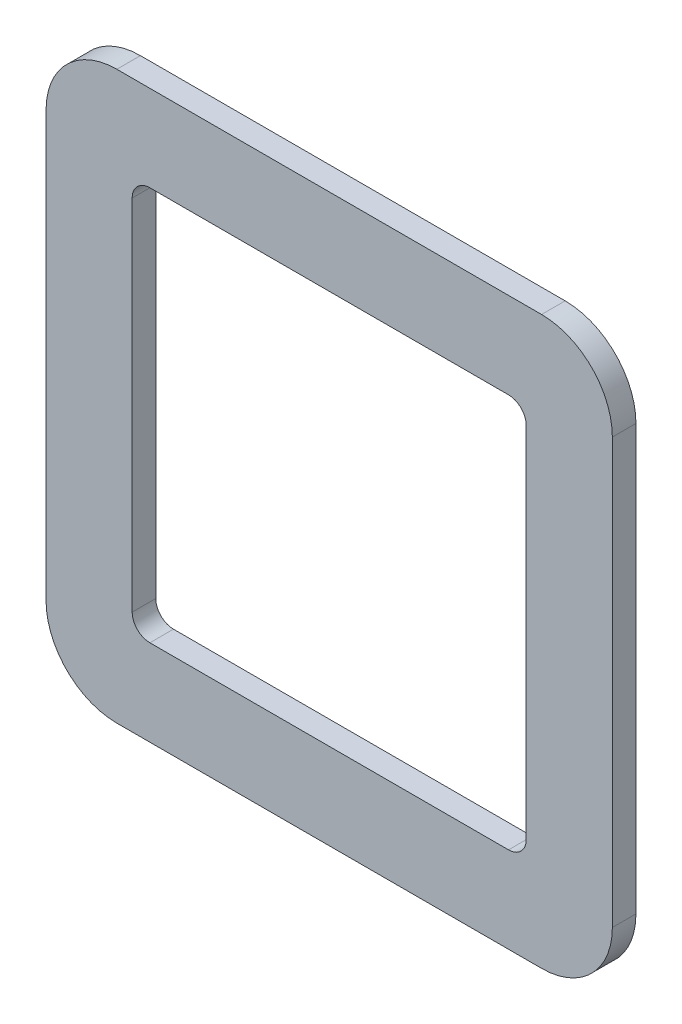
ISO-10303-21;
HEADER;
FILE_DESCRIPTION(('STEP AP214'),'2;1');
FILE_NAME('part.step','',(''),(''),'','','');
FILE_SCHEMA(('AUTOMOTIVE_DESIGN { 1 0 10303 214 1 1 1 1 }'));
ENDSEC;
DATA;
#1=APPLICATION_CONTEXT('core data for automotive mechanical design processes');
#2=APPLICATION_PROTOCOL_DEFINITION('international standard','automotive_design',2000,#1);
#3=PRODUCT_CONTEXT('',#1,'mechanical');
#4=PRODUCT('Part','Part','',(#3));
#5=PRODUCT_RELATED_PRODUCT_CATEGORY('part','',(#4));
#6=PRODUCT_DEFINITION_FORMATION('','',#4);
#7=PRODUCT_DEFINITION_CONTEXT('part definition',#1,'design');
#8=PRODUCT_DEFINITION('design','',#6,#7);
#9=PRODUCT_DEFINITION_SHAPE('','',#8);
#10=(LENGTH_UNIT() NAMED_UNIT(*) SI_UNIT(.MILLI.,.METRE.));
#11=(NAMED_UNIT(*) PLANE_ANGLE_UNIT() SI_UNIT($,.RADIAN.));
#12=(NAMED_UNIT(*) SI_UNIT($,.STERADIAN.) SOLID_ANGLE_UNIT());
#13=UNCERTAINTY_MEASURE_WITH_UNIT(LENGTH_MEASURE(1.E-05),#10,'distance_accuracy_value','');
#14=(GEOMETRIC_REPRESENTATION_CONTEXT(3) GLOBAL_UNCERTAINTY_ASSIGNED_CONTEXT((#13)) GLOBAL_UNIT_ASSIGNED_CONTEXT((#10,
#11,#12)) REPRESENTATION_CONTEXT('',''));
#15=CARTESIAN_POINT('',(0.,0.,0.));
#16=DIRECTION('',(0.,0.,1.));
#17=DIRECTION('',(1.,0.,0.));
#18=AXIS2_PLACEMENT_3D('',#15,#16,#17);
#19=CARTESIAN_POINT('',(6.096,0.762,0.254));
#20=DIRECTION('',(-1.,0.,0.));
#21=DIRECTION('',(0.,-1.,0.));
#22=AXIS2_PLACEMENT_3D('',#19,#20,#21);
#23=PLANE('',#22);
#24=DIRECTION('',(0.,1.,0.));
#25=VECTOR('',#24,1.);
#26=CARTESIAN_POINT('',(6.096,0.762,-0.254));
#27=LINE('',#26,#25);
#28=CARTESIAN_POINT('',(6.09600000000005,-4.57199999999994,-0.254));
#29=VERTEX_POINT('',#28);
#30=CARTESIAN_POINT('',(6.096,4.572,-0.254));
#31=VERTEX_POINT('',#30);
#32=EDGE_CURVE('E243',#29,#31,#27,.T.);
#33=ORIENTED_EDGE('',*,*,#32,.T.);
#34=DIRECTION('',(0.,0.,-1.));
#35=VECTOR('',#34,1.);
#36=CARTESIAN_POINT('',(6.096,4.572,0.254));
#37=LINE('',#36,#35);
#38=CARTESIAN_POINT('',(6.096,4.572,0.254));
#39=VERTEX_POINT('',#38);
#40=EDGE_CURVE('E12',#39,#31,#37,.T.);
#41=ORIENTED_EDGE('',*,*,#40,.F.);
#42=DIRECTION('',(0.,1.,0.));
#43=VECTOR('',#42,1.);
#44=CARTESIAN_POINT('',(6.096,0.762,0.254));
#45=LINE('',#44,#43);
#46=CARTESIAN_POINT('',(6.09600000000005,-4.57199999999994,0.254));
#47=VERTEX_POINT('',#46);
#48=EDGE_CURVE('E87',#47,#39,#45,.T.);
#49=ORIENTED_EDGE('',*,*,#48,.F.);
#50=DIRECTION('',(0.,0.,-1.));
#51=VECTOR('',#50,1.);
#52=CARTESIAN_POINT('',(6.09600000000005,-4.57199999999994,0.254));
#53=LINE('',#52,#51);
#54=EDGE_CURVE('E177',#47,#29,#53,.T.);
#55=ORIENTED_EDGE('',*,*,#54,.T.);
#56=EDGE_LOOP('',(#33,#41,#49,#55));
#57=FACE_BOUND('',#56,.T.);
#58=ADVANCED_FACE('F39',(#57),#23,.F.);
#59=CARTESIAN_POINT('',(4.572,4.572,0.254));
#60=DIRECTION('',(0.,0.,-1.));
#61=DIRECTION('',(-1.,0.,0.));
#62=AXIS2_PLACEMENT_3D('',#59,#60,#61);
#63=CYLINDRICAL_SURFACE('',#62,1.524);
#64=CARTESIAN_POINT('',(4.572,4.572,-0.254));
#65=DIRECTION('',(0.,0.,1.));
#66=DIRECTION('',(1.,0.,0.));
#67=AXIS2_PLACEMENT_3D('',#64,#65,#66);
#68=CIRCLE('',#67,1.524);
#69=CARTESIAN_POINT('',(4.572,6.096,-0.254));
#70=VERTEX_POINT('',#69);
#71=EDGE_CURVE('E260',#31,#70,#68,.T.);
#72=ORIENTED_EDGE('',*,*,#71,.T.);
#73=DIRECTION('',(0.,0.,-1.));
#74=VECTOR('',#73,1.);
#75=CARTESIAN_POINT('',(4.572,6.096,0.254));
#76=LINE('',#75,#74);
#77=CARTESIAN_POINT('',(4.572,6.096,0.254));
#78=VERTEX_POINT('',#77);
#79=EDGE_CURVE('E47',#78,#70,#76,.T.);
#80=ORIENTED_EDGE('',*,*,#79,.F.);
#81=CARTESIAN_POINT('',(4.572,4.572,0.254));
#82=DIRECTION('',(0.,0.,1.));
#83=DIRECTION('',(1.,0.,0.));
#84=AXIS2_PLACEMENT_3D('',#81,#82,#83);
#85=CIRCLE('',#84,1.524);
#86=EDGE_CURVE('E245',#39,#78,#85,.T.);
#87=ORIENTED_EDGE('',*,*,#86,.F.);
#88=ORIENTED_EDGE('',*,*,#40,.T.);
#89=EDGE_LOOP('',(#72,#80,#87,#88));
#90=FACE_BOUND('',#89,.T.);
#91=ADVANCED_FACE('F289',(#90),#63,.T.);
#92=CARTESIAN_POINT('',(4.572,6.096,0.254));
#93=DIRECTION('',(0.,-1.,0.));
#94=DIRECTION('',(0.,0.,-1.));
#95=AXIS2_PLACEMENT_3D('',#92,#93,#94);
#96=PLANE('',#95);
#97=DIRECTION('',(0.,0.,-1.));
#98=VECTOR('',#97,1.);
#99=CARTESIAN_POINT('',(-4.57200000000002,6.09599999999998,0.254));
#100=LINE('',#99,#98);
#101=CARTESIAN_POINT('',(-4.57200000000002,6.09599999999998,0.254));
#102=VERTEX_POINT('',#101);
#103=CARTESIAN_POINT('',(-4.57200000000002,6.09599999999998,-0.254));
#104=VERTEX_POINT('',#103);
#105=EDGE_CURVE('E240',#102,#104,#100,.T.);
#106=ORIENTED_EDGE('',*,*,#105,.F.);
#107=DIRECTION('',(-1.,0.,0.));
#108=VECTOR('',#107,1.);
#109=CARTESIAN_POINT('',(4.572,6.096,0.254));
#110=LINE('',#109,#108);
#111=EDGE_CURVE('E247',#78,#102,#110,.T.);
#112=ORIENTED_EDGE('',*,*,#111,.F.);
#113=ORIENTED_EDGE('',*,*,#79,.T.);
#114=DIRECTION('',(-1.,0.,0.));
#115=VECTOR('',#114,1.);
#116=CARTESIAN_POINT('',(4.572,6.096,-0.254));
#117=LINE('',#116,#115);
#118=EDGE_CURVE('E262',#70,#104,#117,.T.);
#119=ORIENTED_EDGE('',*,*,#118,.T.);
#120=EDGE_LOOP('',(#106,#112,#113,#119));
#121=FACE_BOUND('',#120,.T.);
#122=ADVANCED_FACE('F275',(#121),#96,.F.);
#123=CARTESIAN_POINT('',(-0.889000000000001,4.2418,0.254));
#124=DIRECTION('',(0.,1.,0.));
#125=DIRECTION('',(-1.,0.,0.));
#126=AXIS2_PLACEMENT_3D('',#123,#124,#125);
#127=PLANE('',#126);
#128=DIRECTION('',(1.,0.,0.));
#129=VECTOR('',#128,1.);
#130=CARTESIAN_POINT('',(-0.889000000000001,4.2418,-0.254));
#131=LINE('',#130,#129);
#132=CARTESIAN_POINT('',(-3.86080000000001,4.24179999999999,-0.254));
#133=VERTEX_POINT('',#132);
#134=CARTESIAN_POINT('',(3.8608,4.2418,-0.254));
#135=VERTEX_POINT('',#134);
#136=EDGE_CURVE('E73',#133,#135,#131,.T.);
#137=ORIENTED_EDGE('',*,*,#136,.T.);
#138=DIRECTION('',(0.,0.,-1.));
#139=VECTOR('',#138,1.);
#140=CARTESIAN_POINT('',(3.8608,4.2418,0.254));
#141=LINE('',#140,#139);
#142=CARTESIAN_POINT('',(3.8608,4.2418,0.254));
#143=VERTEX_POINT('',#142);
#144=EDGE_CURVE('E268',#143,#135,#141,.T.);
#145=ORIENTED_EDGE('',*,*,#144,.F.);
#146=DIRECTION('',(1.,0.,0.));
#147=VECTOR('',#146,1.);
#148=CARTESIAN_POINT('',(-0.889000000000001,4.2418,0.254));
#149=LINE('',#148,#147);
#150=CARTESIAN_POINT('',(-3.86080000000001,4.24179999999999,0.254));
#151=VERTEX_POINT('',#150);
#152=EDGE_CURVE('E251',#151,#143,#149,.T.);
#153=ORIENTED_EDGE('',*,*,#152,.F.);
#154=DIRECTION('',(0.,0.,-1.));
#155=VECTOR('',#154,1.);
#156=CARTESIAN_POINT('',(-3.86080000000001,4.24179999999999,0.254));
#157=LINE('',#156,#155);
#158=EDGE_CURVE('E225',#151,#133,#157,.T.);
#159=ORIENTED_EDGE('',*,*,#158,.T.);
#160=EDGE_LOOP('',(#137,#145,#153,#159));
#161=FACE_BOUND('',#160,.T.);
#162=ADVANCED_FACE('F327',(#161),#127,.F.);
#163=CARTESIAN_POINT('',(3.8608,3.8608,0.254));
#164=DIRECTION('',(0.,0.,-1.));
#165=DIRECTION('',(-1.,0.,0.));
#166=AXIS2_PLACEMENT_3D('',#163,#164,#165);
#167=CYLINDRICAL_SURFACE('',#166,0.380999999999999);
#168=CARTESIAN_POINT('',(3.8608,3.8608,-0.254));
#169=DIRECTION('',(0.,0.,-1.));
#170=DIRECTION('',(-1.,0.,0.));
#171=AXIS2_PLACEMENT_3D('',#168,#169,#170);
#172=CIRCLE('',#171,0.380999999999999);
#173=CARTESIAN_POINT('',(4.2418,3.8608,-0.254));
#174=VERTEX_POINT('',#173);
#175=EDGE_CURVE('E79',#135,#174,#172,.T.);
#176=ORIENTED_EDGE('',*,*,#175,.T.);
#177=DIRECTION('',(0.,0.,-1.));
#178=VECTOR('',#177,1.);
#179=CARTESIAN_POINT('',(4.2418,3.8608,0.254));
#180=LINE('',#179,#178);
#181=CARTESIAN_POINT('',(4.2418,3.8608,0.254));
#182=VERTEX_POINT('',#181);
#183=EDGE_CURVE('E258',#182,#174,#180,.T.);
#184=ORIENTED_EDGE('',*,*,#183,.F.);
#185=CARTESIAN_POINT('',(3.8608,3.8608,0.254));
#186=DIRECTION('',(0.,0.,-1.));
#187=DIRECTION('',(-1.,0.,0.));
#188=AXIS2_PLACEMENT_3D('',#185,#186,#187);
#189=CIRCLE('',#188,0.380999999999999);
#190=EDGE_CURVE('E55',#143,#182,#189,.T.);
#191=ORIENTED_EDGE('',*,*,#190,.F.);
#192=ORIENTED_EDGE('',*,*,#144,.T.);
#193=EDGE_LOOP('',(#176,#184,#191,#192));
#194=FACE_BOUND('',#193,.T.);
#195=ADVANCED_FACE('F321',(#194),#167,.F.);
#196=CARTESIAN_POINT('',(4.2418,3.8608,0.254));
#197=DIRECTION('',(1.,0.,0.));
#198=DIRECTION('',(0.,0.,-1.));
#199=AXIS2_PLACEMENT_3D('',#196,#197,#198);
#200=PLANE('',#199);
#201=DIRECTION('',(0.,0.,-1.));
#202=VECTOR('',#201,1.);
#203=CARTESIAN_POINT('',(4.24180000000004,-3.86079999999996,0.254));
#204=LINE('',#203,#202);
#205=CARTESIAN_POINT('',(4.24180000000004,-3.86079999999996,0.254));
#206=VERTEX_POINT('',#205);
#207=CARTESIAN_POINT('',(4.24180000000004,-3.86079999999996,-0.254));
#208=VERTEX_POINT('',#207);
#209=EDGE_CURVE('E188',#206,#208,#204,.T.);
#210=ORIENTED_EDGE('',*,*,#209,.F.);
#211=DIRECTION('',(0.,-1.,0.));
#212=VECTOR('',#211,1.);
#213=CARTESIAN_POINT('',(4.2418,3.8608,0.254));
#214=LINE('',#213,#212);
#215=EDGE_CURVE('E256',#182,#206,#214,.T.);
#216=ORIENTED_EDGE('',*,*,#215,.F.);
#217=ORIENTED_EDGE('',*,*,#183,.T.);
#218=DIRECTION('',(0.,-1.,0.));
#219=VECTOR('',#218,1.);
#220=CARTESIAN_POINT('',(4.2418,3.8608,-0.254));
#221=LINE('',#220,#219);
#222=EDGE_CURVE('E246',#174,#208,#221,.T.);
#223=ORIENTED_EDGE('',*,*,#222,.T.);
#224=EDGE_LOOP('',(#210,#216,#217,#223));
#225=FACE_BOUND('',#224,.T.);
#226=ADVANCED_FACE('F320',(#225),#200,.F.);
#227=CARTESIAN_POINT('',(4.572,4.572,0.254));
#228=DIRECTION('',(0.,0.,1.));
#229=DIRECTION('',(1.,0.,0.));
#230=AXIS2_PLACEMENT_3D('',#227,#228,#229);
#231=PLANE('',#230);
#232=CARTESIAN_POINT('',(-3.86080000000001,3.86079999999999,0.254));
#233=DIRECTION('',(0.,0.,-1.));
#234=DIRECTION('',(0.,-1.,0.));
#235=AXIS2_PLACEMENT_3D('',#232,#233,#234);
#236=CIRCLE('',#235,0.380999999999999);
#237=CARTESIAN_POINT('',(-4.24180000000001,3.86079999999999,0.254));
#238=VERTEX_POINT('',#237);
#239=EDGE_CURVE('E222',#238,#151,#236,.T.);
#240=ORIENTED_EDGE('',*,*,#239,.T.);
#241=ORIENTED_EDGE('',*,*,#152,.T.);
#242=ORIENTED_EDGE('',*,*,#190,.T.);
#243=ORIENTED_EDGE('',*,*,#215,.T.);
#244=CARTESIAN_POINT('',(3.86080000000004,-3.86079999999996,0.254));
#245=DIRECTION('',(0.,0.,-1.));
#246=DIRECTION('',(0.,1.,0.));
#247=AXIS2_PLACEMENT_3D('',#244,#245,#246);
#248=CIRCLE('',#247,0.380999999999999);
#249=CARTESIAN_POINT('',(3.86080000000004,-4.24179999999996,0.254));
#250=VERTEX_POINT('',#249);
#251=EDGE_CURVE('E178',#206,#250,#248,.T.);
#252=ORIENTED_EDGE('',*,*,#251,.T.);
#253=DIRECTION('',(-1.,0.,0.));
#254=VECTOR('',#253,1.);
#255=CARTESIAN_POINT('',(0.889000000000001,-4.2418,0.254));
#256=LINE('',#255,#254);
#257=CARTESIAN_POINT('',(-3.8608,-4.2418,0.254));
#258=VERTEX_POINT('',#257);
#259=EDGE_CURVE('E169',#250,#258,#256,.T.);
#260=ORIENTED_EDGE('',*,*,#259,.T.);
#261=CARTESIAN_POINT('',(-3.8608,-3.8608,0.254));
#262=DIRECTION('',(0.,0.,-1.));
#263=DIRECTION('',(1.,0.,0.));
#264=AXIS2_PLACEMENT_3D('',#261,#262,#263);
#265=CIRCLE('',#264,0.380999999999999);
#266=CARTESIAN_POINT('',(-4.2418,-3.8608,0.254));
#267=VERTEX_POINT('',#266);
#268=EDGE_CURVE('E195',#258,#267,#265,.T.);
#269=ORIENTED_EDGE('',*,*,#268,.T.);
#270=DIRECTION('',(0.,1.,0.));
#271=VECTOR('',#270,1.);
#272=CARTESIAN_POINT('',(-4.2418,-0.889000000000015,0.254));
#273=LINE('',#272,#271);
#274=EDGE_CURVE('E220',#267,#238,#273,.T.);
#275=ORIENTED_EDGE('',*,*,#274,.T.);
#276=EDGE_LOOP('',(#240,#241,#242,#243,#252,#260,#269,#275));
#277=FACE_BOUND('',#276,.T.);
#278=ORIENTED_EDGE('',*,*,#48,.T.);
#279=ORIENTED_EDGE('',*,*,#86,.T.);
#280=ORIENTED_EDGE('',*,*,#111,.T.);
#281=CARTESIAN_POINT('',(-4.57200000000002,4.57199999999998,0.254));
#282=DIRECTION('',(0.,0.,1.));
#283=DIRECTION('',(0.,1.,0.));
#284=AXIS2_PLACEMENT_3D('',#281,#282,#283);
#285=CIRCLE('',#284,1.524);
#286=CARTESIAN_POINT('',(-6.09600000000002,4.57199999999998,0.254));
#287=VERTEX_POINT('',#286);
#288=EDGE_CURVE('E215',#102,#287,#285,.T.);
#289=ORIENTED_EDGE('',*,*,#288,.T.);
#290=DIRECTION('',(0.,-1.,0.));
#291=VECTOR('',#290,1.);
#292=CARTESIAN_POINT('',(-6.09600000000002,4.57199999999998,0.254));
#293=LINE('',#292,#291);
#294=CARTESIAN_POINT('',(-6.096,-4.572,0.254));
#295=VERTEX_POINT('',#294);
#296=EDGE_CURVE('E217',#287,#295,#293,.T.);
#297=ORIENTED_EDGE('',*,*,#296,.T.);
#298=CARTESIAN_POINT('',(-4.572,-4.572,0.254));
#299=DIRECTION('',(0.,0.,1.));
#300=DIRECTION('',(-1.,0.,0.));
#301=AXIS2_PLACEMENT_3D('',#298,#299,#300);
#302=CIRCLE('',#301,1.524);
#303=CARTESIAN_POINT('',(-4.572,-6.096,0.254));
#304=VERTEX_POINT('',#303);
#305=EDGE_CURVE('E164',#295,#304,#302,.T.);
#306=ORIENTED_EDGE('',*,*,#305,.T.);
#307=DIRECTION('',(1.,0.,0.));
#308=VECTOR('',#307,1.);
#309=CARTESIAN_POINT('',(-4.572,-6.096,0.254));
#310=LINE('',#309,#308);
#311=CARTESIAN_POINT('',(4.57200000000006,-6.09599999999995,0.254));
#312=VERTEX_POINT('',#311);
#313=EDGE_CURVE('E158',#304,#312,#310,.T.);
#314=ORIENTED_EDGE('',*,*,#313,.T.);
#315=CARTESIAN_POINT('',(4.57200000000005,-4.57199999999995,0.254));
#316=DIRECTION('',(0.,0.,1.));
#317=DIRECTION('',(0.,-1.,0.));
#318=AXIS2_PLACEMENT_3D('',#315,#316,#317);
#319=CIRCLE('',#318,1.524);
#320=EDGE_CURVE('E161',#312,#47,#319,.T.);
#321=ORIENTED_EDGE('',*,*,#320,.T.);
#322=EDGE_LOOP('',(#278,#279,#280,#289,#297,#306,#314,#321));
#323=FACE_BOUND('',#322,.T.);
#324=ADVANCED_FACE('F160',(#277,#323),#231,.T.);
#325=CARTESIAN_POINT('',(4.572,4.572,-0.254));
#326=DIRECTION('',(0.,0.,1.));
#327=DIRECTION('',(1.,0.,0.));
#328=AXIS2_PLACEMENT_3D('',#325,#326,#327);
#329=PLANE('',#328);
#330=ORIENTED_EDGE('',*,*,#136,.F.);
#331=CARTESIAN_POINT('',(-3.86080000000001,3.86079999999999,-0.254));
#332=DIRECTION('',(0.,0.,-1.));
#333=DIRECTION('',(0.,-1.,0.));
#334=AXIS2_PLACEMENT_3D('',#331,#332,#333);
#335=CIRCLE('',#334,0.380999999999999);
#336=CARTESIAN_POINT('',(-4.24180000000001,3.86079999999999,-0.254));
#337=VERTEX_POINT('',#336);
#338=EDGE_CURVE('E218',#337,#133,#335,.T.);
#339=ORIENTED_EDGE('',*,*,#338,.F.);
#340=DIRECTION('',(0.,1.,0.));
#341=VECTOR('',#340,1.);
#342=CARTESIAN_POINT('',(-4.2418,-0.889000000000015,-0.254));
#343=LINE('',#342,#341);
#344=CARTESIAN_POINT('',(-4.2418,-3.8608,-0.254));
#345=VERTEX_POINT('',#344);
#346=EDGE_CURVE('E229',#345,#337,#343,.T.);
#347=ORIENTED_EDGE('',*,*,#346,.F.);
#348=CARTESIAN_POINT('',(-3.8608,-3.8608,-0.254));
#349=DIRECTION('',(0.,0.,-1.));
#350=DIRECTION('',(1.,0.,0.));
#351=AXIS2_PLACEMENT_3D('',#348,#349,#350);
#352=CIRCLE('',#351,0.380999999999999);
#353=CARTESIAN_POINT('',(-3.8608,-4.2418,-0.254));
#354=VERTEX_POINT('',#353);
#355=EDGE_CURVE('E192',#354,#345,#352,.T.);
#356=ORIENTED_EDGE('',*,*,#355,.F.);
#357=DIRECTION('',(-1.,0.,0.));
#358=VECTOR('',#357,1.);
#359=CARTESIAN_POINT('',(0.889000000000001,-4.2418,-0.254));
#360=LINE('',#359,#358);
#361=CARTESIAN_POINT('',(3.86080000000004,-4.24179999999996,-0.254));
#362=VERTEX_POINT('',#361);
#363=EDGE_CURVE('E200',#362,#354,#360,.T.);
#364=ORIENTED_EDGE('',*,*,#363,.F.);
#365=CARTESIAN_POINT('',(3.86080000000004,-3.86079999999996,-0.254));
#366=DIRECTION('',(0.,0.,-1.));
#367=DIRECTION('',(0.,1.,0.));
#368=AXIS2_PLACEMENT_3D('',#365,#366,#367);
#369=CIRCLE('',#368,0.380999999999999);
#370=EDGE_CURVE('E179',#208,#362,#369,.T.);
#371=ORIENTED_EDGE('',*,*,#370,.F.);
#372=ORIENTED_EDGE('',*,*,#222,.F.);
#373=ORIENTED_EDGE('',*,*,#175,.F.);
#374=EDGE_LOOP('',(#330,#339,#347,#356,#364,#371,#372,#373));
#375=FACE_BOUND('',#374,.T.);
#376=CARTESIAN_POINT('',(-4.57200000000002,4.57199999999998,-0.254));
#377=DIRECTION('',(0.,0.,1.));
#378=DIRECTION('',(0.,1.,0.));
#379=AXIS2_PLACEMENT_3D('',#376,#377,#378);
#380=CIRCLE('',#379,1.524);
#381=CARTESIAN_POINT('',(-6.09600000000002,4.57199999999998,-0.254));
#382=VERTEX_POINT('',#381);
#383=EDGE_CURVE('E214',#104,#382,#380,.T.);
#384=ORIENTED_EDGE('',*,*,#383,.F.);
#385=ORIENTED_EDGE('',*,*,#118,.F.);
#386=ORIENTED_EDGE('',*,*,#71,.F.);
#387=ORIENTED_EDGE('',*,*,#32,.F.);
#388=CARTESIAN_POINT('',(4.57200000000005,-4.57199999999995,-0.254));
#389=DIRECTION('',(0.,0.,1.));
#390=DIRECTION('',(0.,-1.,0.));
#391=AXIS2_PLACEMENT_3D('',#388,#389,#390);
#392=CIRCLE('',#391,1.524);
#393=CARTESIAN_POINT('',(4.57200000000006,-6.09599999999995,-0.254));
#394=VERTEX_POINT('',#393);
#395=EDGE_CURVE('E291',#394,#29,#392,.T.);
#396=ORIENTED_EDGE('',*,*,#395,.F.);
#397=DIRECTION('',(1.,0.,0.));
#398=VECTOR('',#397,1.);
#399=CARTESIAN_POINT('',(-4.572,-6.096,-0.254));
#400=LINE('',#399,#398);
#401=CARTESIAN_POINT('',(-4.572,-6.096,-0.254));
#402=VERTEX_POINT('',#401);
#403=EDGE_CURVE('E183',#402,#394,#400,.T.);
#404=ORIENTED_EDGE('',*,*,#403,.F.);
#405=CARTESIAN_POINT('',(-4.572,-4.572,-0.254));
#406=DIRECTION('',(0.,0.,1.));
#407=DIRECTION('',(-1.,0.,0.));
#408=AXIS2_PLACEMENT_3D('',#405,#406,#407);
#409=CIRCLE('',#408,1.524);
#410=CARTESIAN_POINT('',(-6.096,-4.572,-0.254));
#411=VERTEX_POINT('',#410);
#412=EDGE_CURVE('E185',#411,#402,#409,.T.);
#413=ORIENTED_EDGE('',*,*,#412,.F.);
#414=DIRECTION('',(0.,-1.,0.));
#415=VECTOR('',#414,1.);
#416=CARTESIAN_POINT('',(-6.09600000000002,4.57199999999998,-0.254));
#417=LINE('',#416,#415);
#418=EDGE_CURVE('E227',#382,#411,#417,.T.);
#419=ORIENTED_EDGE('',*,*,#418,.F.);
#420=EDGE_LOOP('',(#384,#385,#386,#387,#396,#404,#413,#419));
#421=FACE_BOUND('',#420,.T.);
#422=ADVANCED_FACE('F280',(#375,#421),#329,.F.);
#423=CARTESIAN_POINT('',(-4.57200000000002,4.57199999999998,0.254));
#424=DIRECTION('',(0.,0.,-1.));
#425=DIRECTION('',(-1.,0.,0.));
#426=AXIS2_PLACEMENT_3D('',#423,#424,#425);
#427=CYLINDRICAL_SURFACE('',#426,1.524);
#428=ORIENTED_EDGE('',*,*,#383,.T.);
#429=DIRECTION('',(0.,0.,-1.));
#430=VECTOR('',#429,1.);
#431=CARTESIAN_POINT('',(-6.09600000000002,4.57199999999998,0.254));
#432=LINE('',#431,#430);
#433=EDGE_CURVE('E237',#287,#382,#432,.T.);
#434=ORIENTED_EDGE('',*,*,#433,.F.);
#435=ORIENTED_EDGE('',*,*,#288,.F.);
#436=ORIENTED_EDGE('',*,*,#105,.T.);
#437=EDGE_LOOP('',(#428,#434,#435,#436));
#438=FACE_BOUND('',#437,.T.);
#439=ADVANCED_FACE('F286',(#438),#427,.T.);
#440=CARTESIAN_POINT('',(-6.09600000000002,4.57199999999998,0.254));
#441=DIRECTION('',(1.,0.,0.));
#442=DIRECTION('',(0.,1.,0.));
#443=AXIS2_PLACEMENT_3D('',#440,#441,#442);
#444=PLANE('',#443);
#445=DIRECTION('',(0.,0.,-1.));
#446=VECTOR('',#445,1.);
#447=CARTESIAN_POINT('',(-6.096,-4.572,0.254));
#448=LINE('',#447,#446);
#449=EDGE_CURVE('E211',#295,#411,#448,.T.);
#450=ORIENTED_EDGE('',*,*,#449,.F.);
#451=ORIENTED_EDGE('',*,*,#296,.F.);
#452=ORIENTED_EDGE('',*,*,#433,.T.);
#453=ORIENTED_EDGE('',*,*,#418,.T.);
#454=EDGE_LOOP('',(#450,#451,#452,#453));
#455=FACE_BOUND('',#454,.T.);
#456=ADVANCED_FACE('F393',(#455),#444,.F.);
#457=CARTESIAN_POINT('',(-4.2418,-0.889000000000015,0.254));
#458=DIRECTION('',(-1.,0.,0.));
#459=DIRECTION('',(0.,-1.,0.));
#460=AXIS2_PLACEMENT_3D('',#457,#458,#459);
#461=PLANE('',#460);
#462=ORIENTED_EDGE('',*,*,#346,.T.);
#463=DIRECTION('',(0.,0.,-1.));
#464=VECTOR('',#463,1.);
#465=CARTESIAN_POINT('',(-4.24180000000001,3.86079999999999,0.254));
#466=LINE('',#465,#464);
#467=EDGE_CURVE('E234',#238,#337,#466,.T.);
#468=ORIENTED_EDGE('',*,*,#467,.F.);
#469=ORIENTED_EDGE('',*,*,#274,.F.);
#470=DIRECTION('',(0.,0.,-1.));
#471=VECTOR('',#470,1.);
#472=CARTESIAN_POINT('',(-4.2418,-3.8608,0.254));
#473=LINE('',#472,#471);
#474=EDGE_CURVE('E197',#267,#345,#473,.T.);
#475=ORIENTED_EDGE('',*,*,#474,.T.);
#476=EDGE_LOOP('',(#462,#468,#469,#475));
#477=FACE_BOUND('',#476,.T.);
#478=ADVANCED_FACE('F403',(#477),#461,.F.);
#479=CARTESIAN_POINT('',(-3.86080000000001,3.86079999999999,0.254));
#480=DIRECTION('',(0.,0.,-1.));
#481=DIRECTION('',(-1.,0.,0.));
#482=AXIS2_PLACEMENT_3D('',#479,#480,#481);
#483=CYLINDRICAL_SURFACE('',#482,0.380999999999999);
#484=ORIENTED_EDGE('',*,*,#338,.T.);
#485=ORIENTED_EDGE('',*,*,#158,.F.);
#486=ORIENTED_EDGE('',*,*,#239,.F.);
#487=ORIENTED_EDGE('',*,*,#467,.T.);
#488=EDGE_LOOP('',(#484,#485,#486,#487));
#489=FACE_BOUND('',#488,.T.);
#490=ADVANCED_FACE('F325',(#489),#483,.F.);
#491=CARTESIAN_POINT('',(-4.572,-4.572,0.254));
#492=DIRECTION('',(0.,0.,-1.));
#493=DIRECTION('',(-1.,0.,0.));
#494=AXIS2_PLACEMENT_3D('',#491,#492,#493);
#495=CYLINDRICAL_SURFACE('',#494,1.524);
#496=ORIENTED_EDGE('',*,*,#412,.T.);
#497=DIRECTION('',(0.,0.,-1.));
#498=VECTOR('',#497,1.);
#499=CARTESIAN_POINT('',(-4.572,-6.096,0.254));
#500=LINE('',#499,#498);
#501=EDGE_CURVE('E209',#304,#402,#500,.T.);
#502=ORIENTED_EDGE('',*,*,#501,.F.);
#503=ORIENTED_EDGE('',*,*,#305,.F.);
#504=ORIENTED_EDGE('',*,*,#449,.T.);
#505=EDGE_LOOP('',(#496,#502,#503,#504));
#506=FACE_BOUND('',#505,.T.);
#507=ADVANCED_FACE('F423',(#506),#495,.T.);
#508=CARTESIAN_POINT('',(-4.572,-6.096,0.254));
#509=DIRECTION('',(0.,1.,0.));
#510=DIRECTION('',(0.,0.,1.));
#511=AXIS2_PLACEMENT_3D('',#508,#509,#510);
#512=PLANE('',#511);
#513=DIRECTION('',(0.,0.,-1.));
#514=VECTOR('',#513,1.);
#515=CARTESIAN_POINT('',(4.57200000000006,-6.09599999999995,0.254));
#516=LINE('',#515,#514);
#517=EDGE_CURVE('E175',#312,#394,#516,.T.);
#518=ORIENTED_EDGE('',*,*,#517,.F.);
#519=ORIENTED_EDGE('',*,*,#313,.F.);
#520=ORIENTED_EDGE('',*,*,#501,.T.);
#521=ORIENTED_EDGE('',*,*,#403,.T.);
#522=EDGE_LOOP('',(#518,#519,#520,#521));
#523=FACE_BOUND('',#522,.T.);
#524=ADVANCED_FACE('F181',(#523),#512,.F.);
#525=CARTESIAN_POINT('',(0.889000000000001,-4.2418,0.254));
#526=DIRECTION('',(0.,-1.,0.));
#527=DIRECTION('',(1.,0.,0.));
#528=AXIS2_PLACEMENT_3D('',#525,#526,#527);
#529=PLANE('',#528);
#530=ORIENTED_EDGE('',*,*,#363,.T.);
#531=DIRECTION('',(0.,0.,-1.));
#532=VECTOR('',#531,1.);
#533=CARTESIAN_POINT('',(-3.8608,-4.2418,0.254));
#534=LINE('',#533,#532);
#535=EDGE_CURVE('E206',#258,#354,#534,.T.);
#536=ORIENTED_EDGE('',*,*,#535,.F.);
#537=ORIENTED_EDGE('',*,*,#259,.F.);
#538=DIRECTION('',(0.,0.,-1.));
#539=VECTOR('',#538,1.);
#540=CARTESIAN_POINT('',(3.86080000000004,-4.24179999999996,0.254));
#541=LINE('',#540,#539);
#542=EDGE_CURVE('E297',#250,#362,#541,.T.);
#543=ORIENTED_EDGE('',*,*,#542,.T.);
#544=EDGE_LOOP('',(#530,#536,#537,#543));
#545=FACE_BOUND('',#544,.T.);
#546=ADVANCED_FACE('F314',(#545),#529,.F.);
#547=CARTESIAN_POINT('',(-3.8608,-3.8608,0.254));
#548=DIRECTION('',(0.,0.,-1.));
#549=DIRECTION('',(-1.,0.,0.));
#550=AXIS2_PLACEMENT_3D('',#547,#548,#549);
#551=CYLINDRICAL_SURFACE('',#550,0.380999999999999);
#552=ORIENTED_EDGE('',*,*,#355,.T.);
#553=ORIENTED_EDGE('',*,*,#474,.F.);
#554=ORIENTED_EDGE('',*,*,#268,.F.);
#555=ORIENTED_EDGE('',*,*,#535,.T.);
#556=EDGE_LOOP('',(#552,#553,#554,#555));
#557=FACE_BOUND('',#556,.T.);
#558=ADVANCED_FACE('F317',(#557),#551,.F.);
#559=CARTESIAN_POINT('',(4.57200000000005,-4.57199999999995,0.254));
#560=DIRECTION('',(0.,0.,-1.));
#561=DIRECTION('',(-1.,0.,0.));
#562=AXIS2_PLACEMENT_3D('',#559,#560,#561);
#563=CYLINDRICAL_SURFACE('',#562,1.524);
#564=ORIENTED_EDGE('',*,*,#395,.T.);
#565=ORIENTED_EDGE('',*,*,#54,.F.);
#566=ORIENTED_EDGE('',*,*,#320,.F.);
#567=ORIENTED_EDGE('',*,*,#517,.T.);
#568=EDGE_LOOP('',(#564,#565,#566,#567));
#569=FACE_BOUND('',#568,.T.);
#570=ADVANCED_FACE('F174',(#569),#563,.T.);
#571=CARTESIAN_POINT('',(3.86080000000004,-3.86079999999996,0.254));
#572=DIRECTION('',(0.,0.,-1.));
#573=DIRECTION('',(-1.,0.,0.));
#574=AXIS2_PLACEMENT_3D('',#571,#572,#573);
#575=CYLINDRICAL_SURFACE('',#574,0.380999999999999);
#576=ORIENTED_EDGE('',*,*,#370,.T.);
#577=ORIENTED_EDGE('',*,*,#542,.F.);
#578=ORIENTED_EDGE('',*,*,#251,.F.);
#579=ORIENTED_EDGE('',*,*,#209,.T.);
#580=EDGE_LOOP('',(#576,#577,#578,#579));
#581=FACE_BOUND('',#580,.T.);
#582=ADVANCED_FACE('F304',(#581),#575,.F.);
#583=CLOSED_SHELL('',(#58,#91,#122,#162,#195,#226,#324,#422,#439,#456,#478,#490,#507,#524,#546,
#558,#570,#582));
#584=MANIFOLD_SOLID_BREP('B2',#583);
#585=ADVANCED_BREP_SHAPE_REPRESENTATION('',(#18,#584),#14);
#586=SHAPE_DEFINITION_REPRESENTATION(#9,#585);
ENDSEC;
END-ISO-10303-21;
